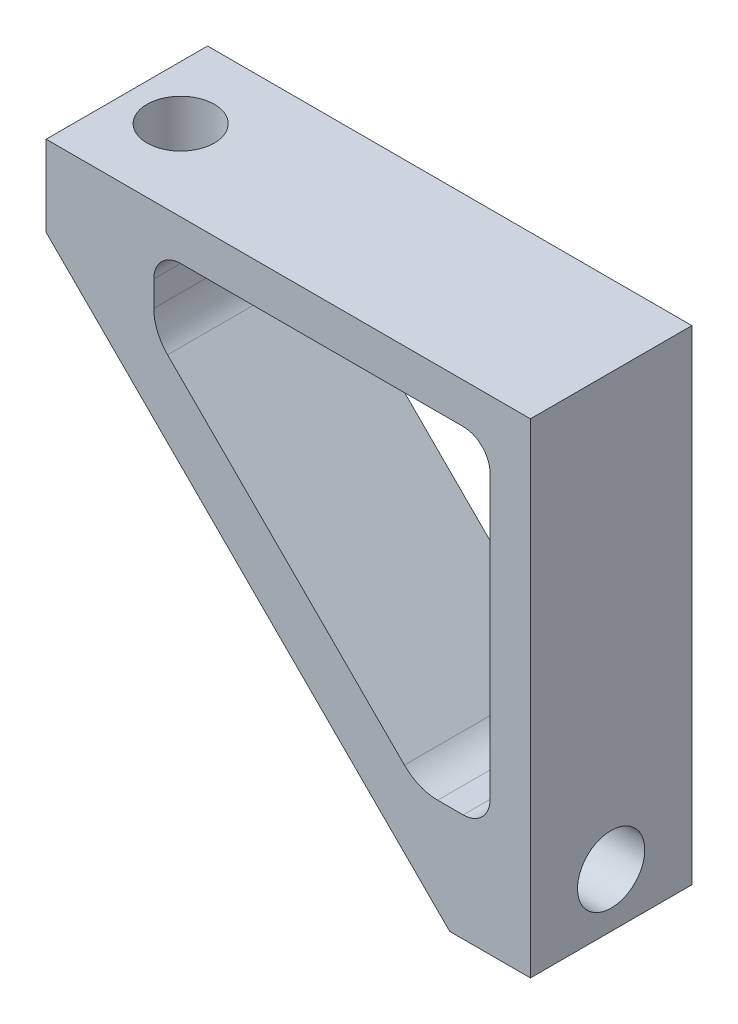
ISO-10303-21;
HEADER;
FILE_DESCRIPTION(('STEP AP214'),'2;1');
FILE_NAME('part.step','',(''),(''),'','','');
FILE_SCHEMA(('AUTOMOTIVE_DESIGN { 1 0 10303 214 1 1 1 1 }'));
ENDSEC;
DATA;
#1=APPLICATION_CONTEXT('core data for automotive mechanical design processes');
#2=APPLICATION_PROTOCOL_DEFINITION('international standard','automotive_design',2000,#1);
#3=PRODUCT_CONTEXT('',#1,'mechanical');
#4=PRODUCT('Part','Part','',(#3));
#5=PRODUCT_RELATED_PRODUCT_CATEGORY('part','',(#4));
#6=PRODUCT_DEFINITION_FORMATION('','',#4);
#7=PRODUCT_DEFINITION_CONTEXT('part definition',#1,'design');
#8=PRODUCT_DEFINITION('design','',#6,#7);
#9=PRODUCT_DEFINITION_SHAPE('','',#8);
#10=(LENGTH_UNIT() NAMED_UNIT(*) SI_UNIT(.MILLI.,.METRE.));
#11=(NAMED_UNIT(*) PLANE_ANGLE_UNIT() SI_UNIT($,.RADIAN.));
#12=(NAMED_UNIT(*) SI_UNIT($,.STERADIAN.) SOLID_ANGLE_UNIT());
#13=UNCERTAINTY_MEASURE_WITH_UNIT(LENGTH_MEASURE(1.E-05),#10,'distance_accuracy_value','');
#14=(GEOMETRIC_REPRESENTATION_CONTEXT(3) GLOBAL_UNCERTAINTY_ASSIGNED_CONTEXT((#13)) GLOBAL_UNIT_ASSIGNED_CONTEXT((#10,
#11,#12)) REPRESENTATION_CONTEXT('',''));
#15=CARTESIAN_POINT('',(0.,0.,0.));
#16=DIRECTION('',(0.,0.,1.));
#17=DIRECTION('',(1.,0.,0.));
#18=AXIS2_PLACEMENT_3D('',#15,#16,#17);
#19=CARTESIAN_POINT('',(-18.,0.,6.));
#20=DIRECTION('',(1.,0.,0.));
#21=DIRECTION('',(0.,0.,-1.));
#22=AXIS2_PLACEMENT_3D('',#19,#20,#21);
#23=PLANE('',#22);
#24=DIRECTION('',(0.,-1.,0.));
#25=VECTOR('',#24,1.);
#26=CARTESIAN_POINT('',(-18.,0.,0.));
#27=LINE('',#26,#25);
#28=CARTESIAN_POINT('',(-18.,0.,0.));
#29=VERTEX_POINT('',#28);
#30=CARTESIAN_POINT('',(-18.,-3.,0.));
#31=VERTEX_POINT('',#30);
#32=EDGE_CURVE('E172',#29,#31,#27,.T.);
#33=ORIENTED_EDGE('',*,*,#32,.T.);
#34=DIRECTION('',(0.,0.,-1.));
#35=VECTOR('',#34,1.);
#36=CARTESIAN_POINT('',(-18.,-3.,6.));
#37=LINE('',#36,#35);
#38=CARTESIAN_POINT('',(-18.,-3.,6.));
#39=VERTEX_POINT('',#38);
#40=EDGE_CURVE('E152',#39,#31,#37,.T.);
#41=ORIENTED_EDGE('',*,*,#40,.F.);
#42=DIRECTION('',(0.,-1.,0.));
#43=VECTOR('',#42,1.);
#44=CARTESIAN_POINT('',(-18.,0.,6.));
#45=LINE('',#44,#43);
#46=CARTESIAN_POINT('',(-18.,0.,6.));
#47=VERTEX_POINT('',#46);
#48=EDGE_CURVE('E161',#47,#39,#45,.T.);
#49=ORIENTED_EDGE('',*,*,#48,.F.);
#50=DIRECTION('',(0.,0.,-1.));
#51=VECTOR('',#50,1.);
#52=CARTESIAN_POINT('',(-18.,0.,6.));
#53=LINE('',#52,#51);
#54=EDGE_CURVE('E258',#47,#29,#53,.T.);
#55=ORIENTED_EDGE('',*,*,#54,.T.);
#56=EDGE_LOOP('',(#33,#41,#49,#55));
#57=FACE_BOUND('',#56,.T.);
#58=ADVANCED_FACE('F43',(#57),#23,.F.);
#59=CARTESIAN_POINT('',(-18.,-3.,6.));
#60=DIRECTION('',(0.707106781186548,0.707106781186548,0.));
#61=DIRECTION('',(-0.707106781186548,0.707106781186548,0.));
#62=AXIS2_PLACEMENT_3D('',#59,#60,#61);
#63=PLANE('',#62);
#64=CARTESIAN_POINT('',(-16.,-5.,3.));
#65=DIRECTION('',(0.707106781186548,0.707106781186548,0.));
#66=DIRECTION('',(-0.707106781186548,0.707106781186548,0.));
#67=AXIS2_PLACEMENT_3D('',#64,#65,#66);
#68=ELLIPSE('',#67,1.76776695296637,1.25);
#69=CARTESIAN_POINT('',(-17.25,-3.75,3.));
#70=VERTEX_POINT('',#69);
#71=EDGE_CURVE('E444',#70,#70,#68,.F.);
#72=ORIENTED_EDGE('',*,*,#71,.F.);
#73=EDGE_LOOP('',(#72));
#74=FACE_BOUND('',#73,.T.);
#75=CARTESIAN_POINT('',(-5.,-16.,3.));
#76=DIRECTION('',(0.707106781186548,0.707106781186548,0.));
#77=DIRECTION('',(0.707106781186548,-0.707106781186548,0.));
#78=AXIS2_PLACEMENT_3D('',#75,#76,#77);
#79=ELLIPSE('',#78,1.76776695296637,1.25);
#80=CARTESIAN_POINT('',(-3.74999999999999,-17.25,3.));
#81=VERTEX_POINT('',#80);
#82=EDGE_CURVE('E334',#81,#81,#79,.T.);
#83=ORIENTED_EDGE('',*,*,#82,.T.);
#84=EDGE_LOOP('',(#83));
#85=FACE_BOUND('',#84,.T.);
#86=DIRECTION('',(0.707106781186547,-0.707106781186547,0.));
#87=VECTOR('',#86,1.);
#88=CARTESIAN_POINT('',(-18.,-3.,0.));
#89=LINE('',#88,#87);
#90=CARTESIAN_POINT('',(-3.,-18.,0.));
#91=VERTEX_POINT('',#90);
#92=EDGE_CURVE('E256',#31,#91,#89,.T.);
#93=ORIENTED_EDGE('',*,*,#92,.T.);
#94=DIRECTION('',(0.,0.,-1.));
#95=VECTOR('',#94,1.);
#96=CARTESIAN_POINT('',(-3.,-18.,6.));
#97=LINE('',#96,#95);
#98=CARTESIAN_POINT('',(-3.,-18.,6.));
#99=VERTEX_POINT('',#98);
#100=EDGE_CURVE('E160',#99,#91,#97,.T.);
#101=ORIENTED_EDGE('',*,*,#100,.F.);
#102=DIRECTION('',(0.707106781186547,-0.707106781186547,0.));
#103=VECTOR('',#102,1.);
#104=CARTESIAN_POINT('',(-18.,-3.,6.));
#105=LINE('',#104,#103);
#106=EDGE_CURVE('E147',#39,#99,#105,.T.);
#107=ORIENTED_EDGE('',*,*,#106,.F.);
#108=ORIENTED_EDGE('',*,*,#40,.T.);
#109=EDGE_LOOP('',(#93,#101,#107,#108));
#110=FACE_BOUND('',#109,.T.);
#111=ADVANCED_FACE('F155',(#74,#85,#110),#63,.F.);
#112=CARTESIAN_POINT('',(-3.,-18.,6.));
#113=DIRECTION('',(0.,1.,0.));
#114=DIRECTION('',(0.,0.,1.));
#115=AXIS2_PLACEMENT_3D('',#112,#113,#114);
#116=PLANE('',#115);
#117=DIRECTION('',(1.,0.,0.));
#118=VECTOR('',#117,1.);
#119=CARTESIAN_POINT('',(-3.,-18.,0.));
#120=LINE('',#119,#118);
#121=CARTESIAN_POINT('',(0.,-18.,0.));
#122=VERTEX_POINT('',#121);
#123=EDGE_CURVE('E257',#91,#122,#120,.T.);
#124=ORIENTED_EDGE('',*,*,#123,.T.);
#125=DIRECTION('',(0.,0.,-1.));
#126=VECTOR('',#125,1.);
#127=CARTESIAN_POINT('',(0.,-18.,6.));
#128=LINE('',#127,#126);
#129=CARTESIAN_POINT('',(0.,-18.,6.));
#130=VERTEX_POINT('',#129);
#131=EDGE_CURVE('E176',#130,#122,#128,.T.);
#132=ORIENTED_EDGE('',*,*,#131,.F.);
#133=DIRECTION('',(1.,0.,0.));
#134=VECTOR('',#133,1.);
#135=CARTESIAN_POINT('',(-3.,-18.,6.));
#136=LINE('',#135,#134);
#137=EDGE_CURVE('E159',#99,#130,#136,.T.);
#138=ORIENTED_EDGE('',*,*,#137,.F.);
#139=ORIENTED_EDGE('',*,*,#100,.T.);
#140=EDGE_LOOP('',(#124,#132,#138,#139));
#141=FACE_BOUND('',#140,.T.);
#142=ADVANCED_FACE('F287',(#141),#116,.F.);
#143=CARTESIAN_POINT('',(0.,0.,6.));
#144=DIRECTION('',(-1.,0.,0.));
#145=DIRECTION('',(0.,-1.,0.));
#146=AXIS2_PLACEMENT_3D('',#143,#144,#145);
#147=PLANE('',#146);
#148=CARTESIAN_POINT('',(0.,-16.,3.));
#149=DIRECTION('',(1.,0.,0.));
#150=DIRECTION('',(0.,1.,0.));
#151=AXIS2_PLACEMENT_3D('',#148,#149,#150);
#152=CIRCLE('',#151,1.25);
#153=CARTESIAN_POINT('',(0.,-14.75,3.));
#154=VERTEX_POINT('',#153);
#155=EDGE_CURVE('E441',#154,#154,#152,.T.);
#156=ORIENTED_EDGE('',*,*,#155,.F.);
#157=EDGE_LOOP('',(#156));
#158=FACE_BOUND('',#157,.T.);
#159=DIRECTION('',(0.,1.,0.));
#160=VECTOR('',#159,1.);
#161=CARTESIAN_POINT('',(0.,0.,0.));
#162=LINE('',#161,#160);
#163=CARTESIAN_POINT('',(0.,0.,0.));
#164=VERTEX_POINT('',#163);
#165=EDGE_CURVE('E265',#122,#164,#162,.T.);
#166=ORIENTED_EDGE('',*,*,#165,.T.);
#167=DIRECTION('',(0.,0.,-1.));
#168=VECTOR('',#167,1.);
#169=CARTESIAN_POINT('',(0.,0.,6.));
#170=LINE('',#169,#168);
#171=CARTESIAN_POINT('',(0.,0.,6.));
#172=VERTEX_POINT('',#171);
#173=EDGE_CURVE('E266',#172,#164,#170,.T.);
#174=ORIENTED_EDGE('',*,*,#173,.F.);
#175=DIRECTION('',(0.,1.,0.));
#176=VECTOR('',#175,1.);
#177=CARTESIAN_POINT('',(0.,0.,6.));
#178=LINE('',#177,#176);
#179=EDGE_CURVE('E251',#130,#172,#178,.T.);
#180=ORIENTED_EDGE('',*,*,#179,.F.);
#181=ORIENTED_EDGE('',*,*,#131,.T.);
#182=EDGE_LOOP('',(#166,#174,#180,#181));
#183=FACE_BOUND('',#182,.T.);
#184=ADVANCED_FACE('F272',(#158,#183),#147,.F.);
#185=CARTESIAN_POINT('',(-18.,0.,6.));
#186=DIRECTION('',(0.,-1.,0.));
#187=DIRECTION('',(0.,0.,-1.));
#188=AXIS2_PLACEMENT_3D('',#185,#186,#187);
#189=PLANE('',#188);
#190=CARTESIAN_POINT('',(-16.,0.,3.));
#191=DIRECTION('',(0.,-1.,0.));
#192=DIRECTION('',(1.,0.,0.));
#193=AXIS2_PLACEMENT_3D('',#190,#191,#192);
#194=CIRCLE('',#193,1.25);
#195=CARTESIAN_POINT('',(-14.75,0.,3.));
#196=VERTEX_POINT('',#195);
#197=EDGE_CURVE('E439',#196,#196,#194,.T.);
#198=ORIENTED_EDGE('',*,*,#197,.T.);
#199=EDGE_LOOP('',(#198));
#200=FACE_BOUND('',#199,.T.);
#201=DIRECTION('',(-1.,0.,0.));
#202=VECTOR('',#201,1.);
#203=CARTESIAN_POINT('',(-18.,0.,0.));
#204=LINE('',#203,#202);
#205=EDGE_CURVE('E168',#164,#29,#204,.T.);
#206=ORIENTED_EDGE('',*,*,#205,.T.);
#207=ORIENTED_EDGE('',*,*,#54,.F.);
#208=DIRECTION('',(-1.,0.,0.));
#209=VECTOR('',#208,1.);
#210=CARTESIAN_POINT('',(-18.,0.,6.));
#211=LINE('',#210,#209);
#212=EDGE_CURVE('E167',#172,#47,#211,.T.);
#213=ORIENTED_EDGE('',*,*,#212,.F.);
#214=ORIENTED_EDGE('',*,*,#173,.T.);
#215=EDGE_LOOP('',(#206,#207,#213,#214));
#216=FACE_BOUND('',#215,.T.);
#217=ADVANCED_FACE('F276',(#200,#216),#189,.F.);
#218=CARTESIAN_POINT('',(0.,0.,6.));
#219=DIRECTION('',(0.,0.,1.));
#220=DIRECTION('',(1.,0.,0.));
#221=AXIS2_PLACEMENT_3D('',#218,#219,#220);
#222=PLANE('',#221);
#223=DIRECTION('',(1.,0.,0.));
#224=VECTOR('',#223,1.);
#225=CARTESIAN_POINT('',(-4.17157287525381,-14.,6.));
#226=LINE('',#225,#224);
#227=CARTESIAN_POINT('',(-3.44669914110089,-14.,6.));
#228=VERTEX_POINT('',#227);
#229=CARTESIAN_POINT('',(-2.49999999999999,-14.,6.));
#230=VERTEX_POINT('',#229);
#231=EDGE_CURVE('E244',#228,#230,#226,.T.);
#232=ORIENTED_EDGE('',*,*,#231,.F.);
#233=CARTESIAN_POINT('',(-3.44669914110089,-12.25,6.));
#234=DIRECTION('',(0.,0.,1.));
#235=DIRECTION('',(1.,0.,0.));
#236=AXIS2_PLACEMENT_3D('',#233,#234,#235);
#237=CIRCLE('',#236,1.75);
#238=CARTESIAN_POINT('',(-4.68413600817735,-13.4874368670765,6.));
#239=VERTEX_POINT('',#238);
#240=EDGE_CURVE('E220',#228,#239,#237,.F.);
#241=ORIENTED_EDGE('',*,*,#240,.T.);
#242=DIRECTION('',(0.707106781186547,-0.707106781186548,0.));
#243=VECTOR('',#242,1.);
#244=CARTESIAN_POINT('',(-14.,-4.17157287525381,6.));
#245=LINE('',#244,#243);
#246=CARTESIAN_POINT('',(-13.4874368670765,-4.68413600817735,6.));
#247=VERTEX_POINT('',#246);
#248=EDGE_CURVE('E236',#247,#239,#245,.T.);
#249=ORIENTED_EDGE('',*,*,#248,.F.);
#250=CARTESIAN_POINT('',(-12.25,-3.44669914110089,6.));
#251=DIRECTION('',(0.,0.,1.));
#252=DIRECTION('',(1.,0.,0.));
#253=AXIS2_PLACEMENT_3D('',#250,#251,#252);
#254=CIRCLE('',#253,1.75);
#255=CARTESIAN_POINT('',(-14.,-3.44669914110089,6.));
#256=VERTEX_POINT('',#255);
#257=EDGE_CURVE('E51',#247,#256,#254,.F.);
#258=ORIENTED_EDGE('',*,*,#257,.T.);
#259=DIRECTION('',(0.,-1.,0.));
#260=VECTOR('',#259,1.);
#261=CARTESIAN_POINT('',(-14.,-1.5,6.));
#262=LINE('',#261,#260);
#263=CARTESIAN_POINT('',(-14.,-2.5,6.));
#264=VERTEX_POINT('',#263);
#265=EDGE_CURVE('E248',#264,#256,#262,.T.);
#266=ORIENTED_EDGE('',*,*,#265,.F.);
#267=CARTESIAN_POINT('',(-13.,-2.5,6.));
#268=DIRECTION('',(0.,0.,1.));
#269=DIRECTION('',(1.,0.,0.));
#270=AXIS2_PLACEMENT_3D('',#267,#268,#269);
#271=CIRCLE('',#270,1.);
#272=CARTESIAN_POINT('',(-13.,-1.5,6.));
#273=VERTEX_POINT('',#272);
#274=EDGE_CURVE('E204',#264,#273,#271,.F.);
#275=ORIENTED_EDGE('',*,*,#274,.T.);
#276=DIRECTION('',(-1.,0.,0.));
#277=VECTOR('',#276,1.);
#278=CARTESIAN_POINT('',(-1.5,-1.5,6.));
#279=LINE('',#278,#277);
#280=CARTESIAN_POINT('',(-2.5,-1.5,6.));
#281=VERTEX_POINT('',#280);
#282=EDGE_CURVE('E246',#281,#273,#279,.T.);
#283=ORIENTED_EDGE('',*,*,#282,.F.);
#284=CARTESIAN_POINT('',(-2.5,-2.5,6.));
#285=DIRECTION('',(0.,0.,1.));
#286=DIRECTION('',(1.,0.,0.));
#287=AXIS2_PLACEMENT_3D('',#284,#285,#286);
#288=CIRCLE('',#287,1.);
#289=CARTESIAN_POINT('',(-1.5,-2.5,6.));
#290=VERTEX_POINT('',#289);
#291=EDGE_CURVE('E192',#281,#290,#288,.F.);
#292=ORIENTED_EDGE('',*,*,#291,.T.);
#293=DIRECTION('',(0.,1.,0.));
#294=VECTOR('',#293,1.);
#295=CARTESIAN_POINT('',(-1.5,-14.,6.));
#296=LINE('',#295,#294);
#297=CARTESIAN_POINT('',(-1.5,-13.,6.));
#298=VERTEX_POINT('',#297);
#299=EDGE_CURVE('E335',#298,#290,#296,.T.);
#300=ORIENTED_EDGE('',*,*,#299,.F.);
#301=CARTESIAN_POINT('',(-2.5,-13.,6.));
#302=DIRECTION('',(0.,0.,1.));
#303=DIRECTION('',(1.,0.,0.));
#304=AXIS2_PLACEMENT_3D('',#301,#302,#303);
#305=CIRCLE('',#304,1.);
#306=EDGE_CURVE('E200',#298,#230,#305,.F.);
#307=ORIENTED_EDGE('',*,*,#306,.T.);
#308=EDGE_LOOP('',(#232,#241,#249,#258,#266,#275,#283,#292,#300,#307));
#309=FACE_BOUND('',#308,.T.);
#310=ORIENTED_EDGE('',*,*,#48,.T.);
#311=ORIENTED_EDGE('',*,*,#106,.T.);
#312=ORIENTED_EDGE('',*,*,#137,.T.);
#313=ORIENTED_EDGE('',*,*,#179,.T.);
#314=ORIENTED_EDGE('',*,*,#212,.T.);
#315=EDGE_LOOP('',(#310,#311,#312,#313,#314));
#316=FACE_BOUND('',#315,.T.);
#317=ADVANCED_FACE('F163',(#309,#316),#222,.T.);
#318=CARTESIAN_POINT('',(0.,0.,0.));
#319=DIRECTION('',(0.,0.,1.));
#320=DIRECTION('',(1.,0.,0.));
#321=AXIS2_PLACEMENT_3D('',#318,#319,#320);
#322=PLANE('',#321);
#323=DIRECTION('',(0.,-1.,0.));
#324=VECTOR('',#323,1.);
#325=CARTESIAN_POINT('',(-14.,-1.5,0.));
#326=LINE('',#325,#324);
#327=CARTESIAN_POINT('',(-14.,-2.5,0.));
#328=VERTEX_POINT('',#327);
#329=CARTESIAN_POINT('',(-14.,-3.44669914110089,0.));
#330=VERTEX_POINT('',#329);
#331=EDGE_CURVE('E324',#328,#330,#326,.T.);
#332=ORIENTED_EDGE('',*,*,#331,.T.);
#333=CARTESIAN_POINT('',(-12.25,-3.44669914110089,0.));
#334=DIRECTION('',(0.,0.,1.));
#335=DIRECTION('',(1.,0.,0.));
#336=AXIS2_PLACEMENT_3D('',#333,#334,#335);
#337=CIRCLE('',#336,1.75);
#338=CARTESIAN_POINT('',(-13.4874368670765,-4.68413600817735,0.));
#339=VERTEX_POINT('',#338);
#340=EDGE_CURVE('E11',#330,#339,#337,.T.);
#341=ORIENTED_EDGE('',*,*,#340,.T.);
#342=DIRECTION('',(0.707106781186547,-0.707106781186548,0.));
#343=VECTOR('',#342,1.);
#344=CARTESIAN_POINT('',(-14.,-4.17157287525381,0.));
#345=LINE('',#344,#343);
#346=CARTESIAN_POINT('',(-4.68413600817735,-13.4874368670765,0.));
#347=VERTEX_POINT('',#346);
#348=EDGE_CURVE('E227',#339,#347,#345,.T.);
#349=ORIENTED_EDGE('',*,*,#348,.T.);
#350=CARTESIAN_POINT('',(-3.44669914110089,-12.25,0.));
#351=DIRECTION('',(0.,0.,1.));
#352=DIRECTION('',(1.,0.,0.));
#353=AXIS2_PLACEMENT_3D('',#350,#351,#352);
#354=CIRCLE('',#353,1.75);
#355=CARTESIAN_POINT('',(-3.44669914110089,-14.,0.));
#356=VERTEX_POINT('',#355);
#357=EDGE_CURVE('E218',#347,#356,#354,.T.);
#358=ORIENTED_EDGE('',*,*,#357,.T.);
#359=DIRECTION('',(1.,0.,0.));
#360=VECTOR('',#359,1.);
#361=CARTESIAN_POINT('',(-4.17157287525381,-14.,0.));
#362=LINE('',#361,#360);
#363=CARTESIAN_POINT('',(-2.49999999999999,-14.,0.));
#364=VERTEX_POINT('',#363);
#365=EDGE_CURVE('E228',#356,#364,#362,.T.);
#366=ORIENTED_EDGE('',*,*,#365,.T.);
#367=CARTESIAN_POINT('',(-2.5,-13.,0.));
#368=DIRECTION('',(0.,0.,1.));
#369=DIRECTION('',(1.,0.,0.));
#370=AXIS2_PLACEMENT_3D('',#367,#368,#369);
#371=CIRCLE('',#370,1.);
#372=CARTESIAN_POINT('',(-1.5,-13.,0.));
#373=VERTEX_POINT('',#372);
#374=EDGE_CURVE('E205',#364,#373,#371,.T.);
#375=ORIENTED_EDGE('',*,*,#374,.T.);
#376=DIRECTION('',(0.,1.,0.));
#377=VECTOR('',#376,1.);
#378=CARTESIAN_POINT('',(-1.5,-14.,0.));
#379=LINE('',#378,#377);
#380=CARTESIAN_POINT('',(-1.5,-2.5,0.));
#381=VERTEX_POINT('',#380);
#382=EDGE_CURVE('E240',#373,#381,#379,.T.);
#383=ORIENTED_EDGE('',*,*,#382,.T.);
#384=CARTESIAN_POINT('',(-2.5,-2.5,0.));
#385=DIRECTION('',(0.,0.,1.));
#386=DIRECTION('',(1.,0.,0.));
#387=AXIS2_PLACEMENT_3D('',#384,#385,#386);
#388=CIRCLE('',#387,1.);
#389=CARTESIAN_POINT('',(-2.5,-1.5,0.));
#390=VERTEX_POINT('',#389);
#391=EDGE_CURVE('E197',#381,#390,#388,.T.);
#392=ORIENTED_EDGE('',*,*,#391,.T.);
#393=DIRECTION('',(-1.,0.,0.));
#394=VECTOR('',#393,1.);
#395=CARTESIAN_POINT('',(-1.5,-1.5,0.));
#396=LINE('',#395,#394);
#397=CARTESIAN_POINT('',(-13.,-1.5,0.));
#398=VERTEX_POINT('',#397);
#399=EDGE_CURVE('E330',#390,#398,#396,.T.);
#400=ORIENTED_EDGE('',*,*,#399,.T.);
#401=CARTESIAN_POINT('',(-13.,-2.5,0.));
#402=DIRECTION('',(0.,0.,1.));
#403=DIRECTION('',(1.,0.,0.));
#404=AXIS2_PLACEMENT_3D('',#401,#402,#403);
#405=CIRCLE('',#404,1.);
#406=EDGE_CURVE('E206',#398,#328,#405,.T.);
#407=ORIENTED_EDGE('',*,*,#406,.T.);
#408=EDGE_LOOP('',(#332,#341,#349,#358,#366,#375,#383,#392,#400,#407));
#409=FACE_BOUND('',#408,.T.);
#410=ORIENTED_EDGE('',*,*,#32,.F.);
#411=ORIENTED_EDGE('',*,*,#205,.F.);
#412=ORIENTED_EDGE('',*,*,#165,.F.);
#413=ORIENTED_EDGE('',*,*,#123,.F.);
#414=ORIENTED_EDGE('',*,*,#92,.F.);
#415=EDGE_LOOP('',(#410,#411,#412,#413,#414));
#416=FACE_BOUND('',#415,.T.);
#417=ADVANCED_FACE('F221',(#409,#416),#322,.F.);
#418=CARTESIAN_POINT('',(-4.17157287525381,-14.,0.));
#419=DIRECTION('',(0.,-1.,0.));
#420=DIRECTION('',(1.,0.,0.));
#421=AXIS2_PLACEMENT_3D('',#418,#419,#420);
#422=PLANE('',#421);
#423=ORIENTED_EDGE('',*,*,#365,.F.);
#424=DIRECTION('',(0.,0.,1.));
#425=VECTOR('',#424,1.);
#426=CARTESIAN_POINT('',(-3.44669914110089,-14.,6.));
#427=LINE('',#426,#425);
#428=EDGE_CURVE('E208',#356,#228,#427,.T.);
#429=ORIENTED_EDGE('',*,*,#428,.T.);
#430=ORIENTED_EDGE('',*,*,#231,.T.);
#431=DIRECTION('',(0.,0.,1.));
#432=VECTOR('',#431,1.);
#433=CARTESIAN_POINT('',(-2.49999999999999,-14.,0.));
#434=LINE('',#433,#432);
#435=EDGE_CURVE('E190',#230,#364,#434,.F.);
#436=ORIENTED_EDGE('',*,*,#435,.T.);
#437=EDGE_LOOP('',(#423,#429,#430,#436));
#438=FACE_BOUND('',#437,.T.);
#439=ADVANCED_FACE('F231',(#438),#422,.F.);
#440=CARTESIAN_POINT('',(-14.,-4.17157287525381,0.));
#441=DIRECTION('',(-0.707106781186548,-0.707106781186547,0.));
#442=DIRECTION('',(0.707106781186547,-0.707106781186548,0.));
#443=AXIS2_PLACEMENT_3D('',#440,#441,#442);
#444=PLANE('',#443);
#445=ORIENTED_EDGE('',*,*,#248,.T.);
#446=DIRECTION('',(0.,0.,1.));
#447=VECTOR('',#446,1.);
#448=CARTESIAN_POINT('',(-4.68413600817735,-13.4874368670765,0.));
#449=LINE('',#448,#447);
#450=EDGE_CURVE('E212',#239,#347,#449,.F.);
#451=ORIENTED_EDGE('',*,*,#450,.T.);
#452=ORIENTED_EDGE('',*,*,#348,.F.);
#453=DIRECTION('',(0.,0.,1.));
#454=VECTOR('',#453,1.);
#455=CARTESIAN_POINT('',(-13.4874368670765,-4.68413600817735,6.));
#456=LINE('',#455,#454);
#457=EDGE_CURVE('E211',#339,#247,#456,.T.);
#458=ORIENTED_EDGE('',*,*,#457,.T.);
#459=EDGE_LOOP('',(#445,#451,#452,#458));
#460=FACE_BOUND('',#459,.T.);
#461=ADVANCED_FACE('F245',(#460),#444,.F.);
#462=CARTESIAN_POINT('',(-14.,-1.5,0.));
#463=DIRECTION('',(-1.,0.,0.));
#464=DIRECTION('',(0.,0.,1.));
#465=AXIS2_PLACEMENT_3D('',#462,#463,#464);
#466=PLANE('',#465);
#467=ORIENTED_EDGE('',*,*,#265,.T.);
#468=DIRECTION('',(0.,0.,1.));
#469=VECTOR('',#468,1.);
#470=CARTESIAN_POINT('',(-14.,-3.44669914110089,0.));
#471=LINE('',#470,#469);
#472=EDGE_CURVE('E65',#256,#330,#471,.F.);
#473=ORIENTED_EDGE('',*,*,#472,.T.);
#474=ORIENTED_EDGE('',*,*,#331,.F.);
#475=DIRECTION('',(0.,0.,1.));
#476=VECTOR('',#475,1.);
#477=CARTESIAN_POINT('',(-14.,-2.5,6.));
#478=LINE('',#477,#476);
#479=EDGE_CURVE('E195',#328,#264,#478,.T.);
#480=ORIENTED_EDGE('',*,*,#479,.T.);
#481=EDGE_LOOP('',(#467,#473,#474,#480));
#482=FACE_BOUND('',#481,.T.);
#483=ADVANCED_FACE('F342',(#482),#466,.F.);
#484=CARTESIAN_POINT('',(-1.5,-1.5,0.));
#485=DIRECTION('',(0.,1.,0.));
#486=DIRECTION('',(0.,0.,1.));
#487=AXIS2_PLACEMENT_3D('',#484,#485,#486);
#488=PLANE('',#487);
#489=ORIENTED_EDGE('',*,*,#399,.F.);
#490=DIRECTION('',(0.,0.,1.));
#491=VECTOR('',#490,1.);
#492=CARTESIAN_POINT('',(-2.5,-1.5,6.));
#493=LINE('',#492,#491);
#494=EDGE_CURVE('E178',#390,#281,#493,.T.);
#495=ORIENTED_EDGE('',*,*,#494,.T.);
#496=ORIENTED_EDGE('',*,*,#282,.T.);
#497=DIRECTION('',(0.,0.,1.));
#498=VECTOR('',#497,1.);
#499=CARTESIAN_POINT('',(-13.,-1.5,0.));
#500=LINE('',#499,#498);
#501=EDGE_CURVE('E175',#273,#398,#500,.F.);
#502=ORIENTED_EDGE('',*,*,#501,.T.);
#503=EDGE_LOOP('',(#489,#495,#496,#502));
#504=FACE_BOUND('',#503,.T.);
#505=ADVANCED_FACE('F336',(#504),#488,.F.);
#506=CARTESIAN_POINT('',(-1.5,-14.,0.));
#507=DIRECTION('',(1.,0.,0.));
#508=DIRECTION('',(0.,1.,0.));
#509=AXIS2_PLACEMENT_3D('',#506,#507,#508);
#510=PLANE('',#509);
#511=ORIENTED_EDGE('',*,*,#299,.T.);
#512=DIRECTION('',(0.,0.,1.));
#513=VECTOR('',#512,1.);
#514=CARTESIAN_POINT('',(-1.5,-2.5,0.));
#515=LINE('',#514,#513);
#516=EDGE_CURVE('E189',#290,#381,#515,.F.);
#517=ORIENTED_EDGE('',*,*,#516,.T.);
#518=ORIENTED_EDGE('',*,*,#382,.F.);
#519=DIRECTION('',(0.,0.,1.));
#520=VECTOR('',#519,1.);
#521=CARTESIAN_POINT('',(-1.5,-13.,6.));
#522=LINE('',#521,#520);
#523=EDGE_CURVE('E184',#373,#298,#522,.T.);
#524=ORIENTED_EDGE('',*,*,#523,.T.);
#525=EDGE_LOOP('',(#511,#517,#518,#524));
#526=FACE_BOUND('',#525,.T.);
#527=ADVANCED_FACE('F353',(#526),#510,.F.);
#528=CARTESIAN_POINT('',(-18.,-16.,3.));
#529=DIRECTION('',(1.,0.,0.));
#530=DIRECTION('',(0.,1.,0.));
#531=AXIS2_PLACEMENT_3D('',#528,#529,#530);
#532=CYLINDRICAL_SURFACE('',#531,1.25);
#533=ORIENTED_EDGE('',*,*,#155,.T.);
#534=EDGE_LOOP('',(#533));
#535=FACE_BOUND('',#534,.T.);
#536=ORIENTED_EDGE('',*,*,#82,.F.);
#537=EDGE_LOOP('',(#536));
#538=FACE_BOUND('',#537,.T.);
#539=ADVANCED_FACE('F356',(#535,#538),#532,.F.);
#540=CARTESIAN_POINT('',(-16.,-18.,3.));
#541=DIRECTION('',(0.,1.,0.));
#542=DIRECTION('',(-1.,0.,0.));
#543=AXIS2_PLACEMENT_3D('',#540,#541,#542);
#544=CYLINDRICAL_SURFACE('',#543,1.25);
#545=ORIENTED_EDGE('',*,*,#197,.F.);
#546=EDGE_LOOP('',(#545));
#547=FACE_BOUND('',#546,.T.);
#548=ORIENTED_EDGE('',*,*,#71,.T.);
#549=EDGE_LOOP('',(#548));
#550=FACE_BOUND('',#549,.T.);
#551=ADVANCED_FACE('F306',(#547,#550),#544,.F.);
#552=CARTESIAN_POINT('',(-2.5,-2.5,0.));
#553=DIRECTION('',(0.,0.,-1.));
#554=DIRECTION('',(-1.,0.,0.));
#555=AXIS2_PLACEMENT_3D('',#552,#553,#554);
#556=CYLINDRICAL_SURFACE('',#555,1.);
#557=ORIENTED_EDGE('',*,*,#391,.F.);
#558=ORIENTED_EDGE('',*,*,#516,.F.);
#559=ORIENTED_EDGE('',*,*,#291,.F.);
#560=ORIENTED_EDGE('',*,*,#494,.F.);
#561=EDGE_LOOP('',(#557,#558,#559,#560));
#562=FACE_BOUND('',#561,.T.);
#563=ADVANCED_FACE('F304',(#562),#556,.F.);
#564=CARTESIAN_POINT('',(-2.5,-13.,0.));
#565=DIRECTION('',(0.,0.,-1.));
#566=DIRECTION('',(-1.,0.,0.));
#567=AXIS2_PLACEMENT_3D('',#564,#565,#566);
#568=CYLINDRICAL_SURFACE('',#567,1.);
#569=ORIENTED_EDGE('',*,*,#374,.F.);
#570=ORIENTED_EDGE('',*,*,#435,.F.);
#571=ORIENTED_EDGE('',*,*,#306,.F.);
#572=ORIENTED_EDGE('',*,*,#523,.F.);
#573=EDGE_LOOP('',(#569,#570,#571,#572));
#574=FACE_BOUND('',#573,.T.);
#575=ADVANCED_FACE('F307',(#574),#568,.F.);
#576=CARTESIAN_POINT('',(-13.,-2.5,0.));
#577=DIRECTION('',(0.,0.,-1.));
#578=DIRECTION('',(-1.,0.,0.));
#579=AXIS2_PLACEMENT_3D('',#576,#577,#578);
#580=CYLINDRICAL_SURFACE('',#579,1.);
#581=ORIENTED_EDGE('',*,*,#406,.F.);
#582=ORIENTED_EDGE('',*,*,#501,.F.);
#583=ORIENTED_EDGE('',*,*,#274,.F.);
#584=ORIENTED_EDGE('',*,*,#479,.F.);
#585=EDGE_LOOP('',(#581,#582,#583,#584));
#586=FACE_BOUND('',#585,.T.);
#587=ADVANCED_FACE('F315',(#586),#580,.F.);
#588=CARTESIAN_POINT('',(-3.44669914110089,-12.25,0.));
#589=DIRECTION('',(0.,0.,-1.));
#590=DIRECTION('',(-1.,0.,0.));
#591=AXIS2_PLACEMENT_3D('',#588,#589,#590);
#592=CYLINDRICAL_SURFACE('',#591,1.75);
#593=ORIENTED_EDGE('',*,*,#357,.F.);
#594=ORIENTED_EDGE('',*,*,#450,.F.);
#595=ORIENTED_EDGE('',*,*,#240,.F.);
#596=ORIENTED_EDGE('',*,*,#428,.F.);
#597=EDGE_LOOP('',(#593,#594,#595,#596));
#598=FACE_BOUND('',#597,.T.);
#599=ADVANCED_FACE('F238',(#598),#592,.F.);
#600=CARTESIAN_POINT('',(-12.25,-3.44669914110089,0.));
#601=DIRECTION('',(0.,0.,-1.));
#602=DIRECTION('',(-1.,0.,0.));
#603=AXIS2_PLACEMENT_3D('',#600,#601,#602);
#604=CYLINDRICAL_SURFACE('',#603,1.75);
#605=ORIENTED_EDGE('',*,*,#340,.F.);
#606=ORIENTED_EDGE('',*,*,#472,.F.);
#607=ORIENTED_EDGE('',*,*,#257,.F.);
#608=ORIENTED_EDGE('',*,*,#457,.F.);
#609=EDGE_LOOP('',(#605,#606,#607,#608));
#610=FACE_BOUND('',#609,.T.);
#611=ADVANCED_FACE('F44',(#610),#604,.F.);
#612=CLOSED_SHELL('',(#58,#111,#142,#184,#217,#317,#417,#439,#461,#483,#505,#527,#539,#551,#563,
#575,#587,#599,#611));
#613=MANIFOLD_SOLID_BREP('B2',#612);
#614=ADVANCED_BREP_SHAPE_REPRESENTATION('',(#18,#613),#14);
#615=SHAPE_DEFINITION_REPRESENTATION(#9,#614);
ENDSEC;
END-ISO-10303-21;
